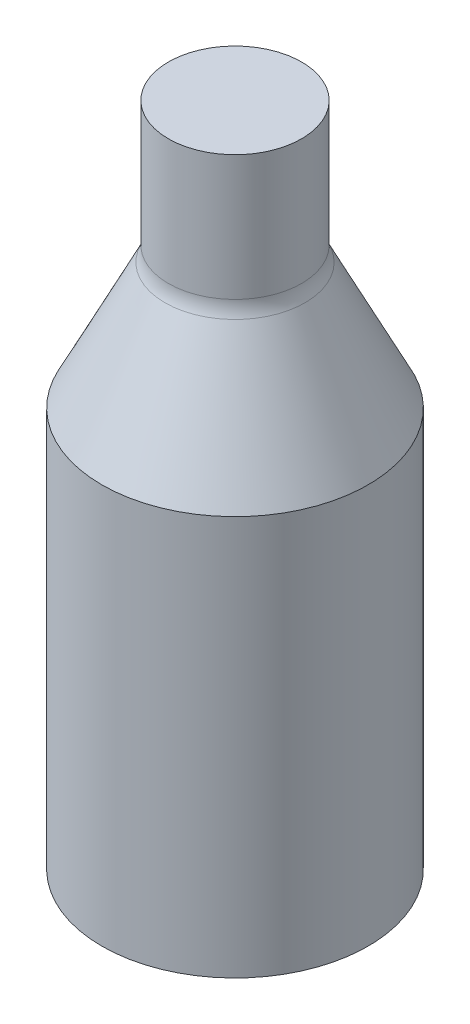
ISO-10303-21;
HEADER;
FILE_DESCRIPTION(('STEP AP214'),'2;1');
FILE_NAME('part.step','',(''),(''),'','','');
FILE_SCHEMA(('AUTOMOTIVE_DESIGN { 1 0 10303 214 1 1 1 1 }'));
ENDSEC;
DATA;
#1=APPLICATION_CONTEXT('core data for automotive mechanical design processes');
#2=APPLICATION_PROTOCOL_DEFINITION('international standard','automotive_design',2000,#1);
#3=PRODUCT_CONTEXT('',#1,'mechanical');
#4=PRODUCT('Part','Part','',(#3));
#5=PRODUCT_RELATED_PRODUCT_CATEGORY('part','',(#4));
#6=PRODUCT_DEFINITION_FORMATION('','',#4);
#7=PRODUCT_DEFINITION_CONTEXT('part definition',#1,'design');
#8=PRODUCT_DEFINITION('design','',#6,#7);
#9=PRODUCT_DEFINITION_SHAPE('','',#8);
#10=(LENGTH_UNIT() NAMED_UNIT(*) SI_UNIT(.MILLI.,.METRE.));
#11=(NAMED_UNIT(*) PLANE_ANGLE_UNIT() SI_UNIT($,.RADIAN.));
#12=(NAMED_UNIT(*) SI_UNIT($,.STERADIAN.) SOLID_ANGLE_UNIT());
#13=UNCERTAINTY_MEASURE_WITH_UNIT(LENGTH_MEASURE(1.E-05),#10,'distance_accuracy_value','');
#14=(GEOMETRIC_REPRESENTATION_CONTEXT(3) GLOBAL_UNCERTAINTY_ASSIGNED_CONTEXT((#13)) GLOBAL_UNIT_ASSIGNED_CONTEXT((#10,
#11,#12)) REPRESENTATION_CONTEXT('',''));
#15=CARTESIAN_POINT('',(0.,0.,0.));
#16=DIRECTION('',(0.,0.,1.));
#17=DIRECTION('',(1.,0.,0.));
#18=AXIS2_PLACEMENT_3D('',#15,#16,#17);
#19=CARTESIAN_POINT('',(20.,0.,0.));
#20=DIRECTION('',(0.,1.,0.));
#21=DIRECTION('',(0.,0.,1.));
#22=AXIS2_PLACEMENT_3D('',#19,#20,#21);
#23=PLANE('',#22);
#24=CARTESIAN_POINT('',(0.,0.,0.));
#25=DIRECTION('',(0.,1.,0.));
#26=DIRECTION('',(0.,0.,1.));
#27=AXIS2_PLACEMENT_3D('',#24,#25,#26);
#28=CIRCLE('',#27,20.);
#29=CARTESIAN_POINT('',(0.,0.,20.));
#30=VERTEX_POINT('',#29);
#31=EDGE_CURVE('E10',#30,#30,#28,.T.);
#32=ORIENTED_EDGE('',*,*,#31,.F.);
#33=EDGE_LOOP('',(#32));
#34=FACE_BOUND('',#33,.T.);
#35=ADVANCED_FACE('F36',(#34),#23,.F.);
#36=CARTESIAN_POINT('',(0.,109.571909522629,0.));
#37=DIRECTION('',(0.,1.,0.));
#38=DIRECTION('',(0.,0.,1.));
#39=AXIS2_PLACEMENT_3D('',#36,#37,#38);
#40=CYLINDRICAL_SURFACE('',#39,20.);
#41=CARTESIAN_POINT('',(0.,60.,0.));
#42=DIRECTION('',(0.,1.,0.));
#43=DIRECTION('',(0.,0.,1.));
#44=AXIS2_PLACEMENT_3D('',#41,#42,#43);
#45=CIRCLE('',#44,20.);
#46=CARTESIAN_POINT('',(0.,60.,20.));
#47=VERTEX_POINT('',#46);
#48=EDGE_CURVE('E42',#47,#47,#45,.T.);
#49=ORIENTED_EDGE('',*,*,#48,.F.);
#50=EDGE_LOOP('',(#49));
#51=FACE_BOUND('',#50,.T.);
#52=ORIENTED_EDGE('',*,*,#31,.T.);
#53=EDGE_LOOP('',(#52));
#54=FACE_BOUND('',#53,.T.);
#55=ADVANCED_FACE('F75',(#51,#54),#40,.T.);
#56=CARTESIAN_POINT('',(0.,60.,0.));
#57=DIRECTION('',(0.,-1.,0.));
#58=DIRECTION('',(0.,0.,-1.));
#59=AXIS2_PLACEMENT_3D('',#56,#57,#58);
#60=CONICAL_SURFACE('',#59,20.,0.463647609000806);
#61=CARTESIAN_POINT('',(0.,78.9442719099991,0.));
#62=DIRECTION('',(0.,1.,0.));
#63=DIRECTION('',(0.,0.,1.));
#64=AXIS2_PLACEMENT_3D('',#61,#62,#63);
#65=CIRCLE('',#64,10.5278640450004);
#66=CARTESIAN_POINT('',(0.,78.9442719099991,10.5278640450004));
#67=VERTEX_POINT('',#66);
#68=EDGE_CURVE('E46',#67,#67,#65,.T.);
#69=ORIENTED_EDGE('',*,*,#68,.F.);
#70=EDGE_LOOP('',(#69));
#71=FACE_BOUND('',#70,.T.);
#72=ORIENTED_EDGE('',*,*,#48,.T.);
#73=EDGE_LOOP('',(#72));
#74=FACE_BOUND('',#73,.T.);
#75=ADVANCED_FACE('F70',(#71,#74),#60,.T.);
#76=CARTESIAN_POINT('',(0.,81.180339887499,0.));
#77=DIRECTION('',(0.,1.,0.));
#78=DIRECTION('',(0.,0.,1.));
#79=AXIS2_PLACEMENT_3D('',#76,#77,#78);
#80=TOROIDAL_SURFACE('',#79,15.,5.);
#81=CARTESIAN_POINT('',(0.,81.180339887499,0.));
#82=DIRECTION('',(0.,1.,0.));
#83=DIRECTION('',(0.,0.,1.));
#84=AXIS2_PLACEMENT_3D('',#81,#82,#83);
#85=CIRCLE('',#84,10.);
#86=CARTESIAN_POINT('',(0.,81.180339887499,10.));
#87=VERTEX_POINT('',#86);
#88=EDGE_CURVE('E50',#87,#87,#85,.T.);
#89=ORIENTED_EDGE('',*,*,#88,.F.);
#90=EDGE_LOOP('',(#89));
#91=FACE_BOUND('',#90,.T.);
#92=ORIENTED_EDGE('',*,*,#68,.T.);
#93=EDGE_LOOP('',(#92));
#94=FACE_BOUND('',#93,.T.);
#95=ADVANCED_FACE('F64',(#91,#94),#80,.F.);
#96=CARTESIAN_POINT('',(0.,109.571909522629,0.));
#97=DIRECTION('',(0.,1.,0.));
#98=DIRECTION('',(0.,0.,1.));
#99=AXIS2_PLACEMENT_3D('',#96,#97,#98);
#100=CYLINDRICAL_SURFACE('',#99,10.);
#101=CARTESIAN_POINT('',(0.,100.,0.));
#102=DIRECTION('',(0.,1.,0.));
#103=DIRECTION('',(0.,0.,1.));
#104=AXIS2_PLACEMENT_3D('',#101,#102,#103);
#105=CIRCLE('',#104,10.);
#106=CARTESIAN_POINT('',(0.,100.,10.));
#107=VERTEX_POINT('',#106);
#108=EDGE_CURVE('E55',#107,#107,#105,.T.);
#109=ORIENTED_EDGE('',*,*,#108,.F.);
#110=EDGE_LOOP('',(#109));
#111=FACE_BOUND('',#110,.T.);
#112=ORIENTED_EDGE('',*,*,#88,.T.);
#113=EDGE_LOOP('',(#112));
#114=FACE_BOUND('',#113,.T.);
#115=ADVANCED_FACE('F61',(#111,#114),#100,.T.);
#116=CARTESIAN_POINT('',(0.,100.,0.));
#117=DIRECTION('',(0.,-1.,0.));
#118=DIRECTION('',(0.,0.,-1.));
#119=AXIS2_PLACEMENT_3D('',#116,#117,#118);
#120=PLANE('',#119);
#121=ORIENTED_EDGE('',*,*,#108,.T.);
#122=EDGE_LOOP('',(#121));
#123=FACE_BOUND('',#122,.T.);
#124=ADVANCED_FACE('F59',(#123),#120,.F.);
#125=CLOSED_SHELL('',(#35,#55,#75,#95,#115,#124));
#126=MANIFOLD_SOLID_BREP('B2',#125);
#127=ADVANCED_BREP_SHAPE_REPRESENTATION('',(#18,#126),#14);
#128=SHAPE_DEFINITION_REPRESENTATION(#9,#127);
ENDSEC;
END-ISO-10303-21;
